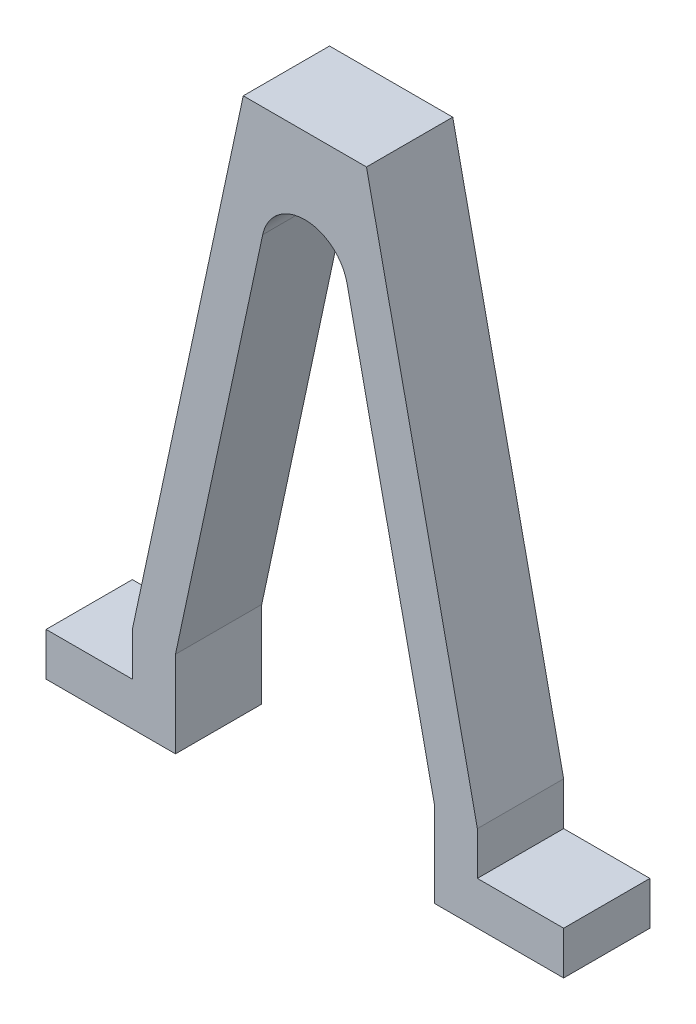
ISO-10303-21;
HEADER;
FILE_DESCRIPTION(('STEP AP214'),'2;1');
FILE_NAME('part.step','',(''),(''),'','','');
FILE_SCHEMA(('AUTOMOTIVE_DESIGN { 1 0 10303 214 1 1 1 1 }'));
ENDSEC;
DATA;
#1=APPLICATION_CONTEXT('core data for automotive mechanical design processes');
#2=APPLICATION_PROTOCOL_DEFINITION('international standard','automotive_design',2000,#1);
#3=PRODUCT_CONTEXT('',#1,'mechanical');
#4=PRODUCT('Part','Part','',(#3));
#5=PRODUCT_RELATED_PRODUCT_CATEGORY('part','',(#4));
#6=PRODUCT_DEFINITION_FORMATION('','',#4);
#7=PRODUCT_DEFINITION_CONTEXT('part definition',#1,'design');
#8=PRODUCT_DEFINITION('design','',#6,#7);
#9=PRODUCT_DEFINITION_SHAPE('','',#8);
#10=(LENGTH_UNIT() NAMED_UNIT(*) SI_UNIT(.MILLI.,.METRE.));
#11=(NAMED_UNIT(*) PLANE_ANGLE_UNIT() SI_UNIT($,.RADIAN.));
#12=(NAMED_UNIT(*) SI_UNIT($,.STERADIAN.) SOLID_ANGLE_UNIT());
#13=UNCERTAINTY_MEASURE_WITH_UNIT(LENGTH_MEASURE(1.E-05),#10,'distance_accuracy_value','');
#14=(GEOMETRIC_REPRESENTATION_CONTEXT(3) GLOBAL_UNCERTAINTY_ASSIGNED_CONTEXT((#13)) GLOBAL_UNIT_ASSIGNED_CONTEXT((#10,
#11,#12)) REPRESENTATION_CONTEXT('',''));
#15=CARTESIAN_POINT('',(0.,0.,0.));
#16=DIRECTION('',(0.,0.,1.));
#17=DIRECTION('',(1.,0.,0.));
#18=AXIS2_PLACEMENT_3D('',#15,#16,#17);
#19=CARTESIAN_POINT('',(0.,5.,10.));
#20=DIRECTION('',(1.,0.,0.));
#21=DIRECTION('',(0.,0.,-1.));
#22=AXIS2_PLACEMENT_3D('',#19,#20,#21);
#23=PLANE('',#22);
#24=DIRECTION('',(0.,-1.,0.));
#25=VECTOR('',#24,1.);
#26=CARTESIAN_POINT('',(0.,5.,0.));
#27=LINE('',#26,#25);
#28=CARTESIAN_POINT('',(0.,5.,0.));
#29=VERTEX_POINT('',#28);
#30=CARTESIAN_POINT('',(0.,0.,0.));
#31=VERTEX_POINT('',#30);
#32=EDGE_CURVE('E188',#29,#31,#27,.T.);
#33=ORIENTED_EDGE('',*,*,#32,.T.);
#34=DIRECTION('',(0.,0.,-1.));
#35=VECTOR('',#34,1.);
#36=CARTESIAN_POINT('',(0.,0.,10.));
#37=LINE('',#36,#35);
#38=CARTESIAN_POINT('',(0.,0.,10.));
#39=VERTEX_POINT('',#38);
#40=EDGE_CURVE('E274',#39,#31,#37,.T.);
#41=ORIENTED_EDGE('',*,*,#40,.F.);
#42=DIRECTION('',(0.,-1.,0.));
#43=VECTOR('',#42,1.);
#44=CARTESIAN_POINT('',(0.,5.,10.));
#45=LINE('',#44,#43);
#46=CARTESIAN_POINT('',(0.,5.,10.));
#47=VERTEX_POINT('',#46);
#48=EDGE_CURVE('E232',#47,#39,#45,.T.);
#49=ORIENTED_EDGE('',*,*,#48,.F.);
#50=DIRECTION('',(0.,0.,-1.));
#51=VECTOR('',#50,1.);
#52=CARTESIAN_POINT('',(0.,5.,10.));
#53=LINE('',#52,#51);
#54=EDGE_CURVE('E187',#47,#29,#53,.T.);
#55=ORIENTED_EDGE('',*,*,#54,.T.);
#56=EDGE_LOOP('',(#33,#41,#49,#55));
#57=FACE_BOUND('',#56,.T.);
#58=ADVANCED_FACE('F39',(#57),#23,.F.);
#59=CARTESIAN_POINT('',(0.,0.,10.));
#60=DIRECTION('',(0.,1.,0.));
#61=DIRECTION('',(0.,0.,1.));
#62=AXIS2_PLACEMENT_3D('',#59,#60,#61);
#63=PLANE('',#62);
#64=DIRECTION('',(1.,0.,0.));
#65=VECTOR('',#64,1.);
#66=CARTESIAN_POINT('',(0.,0.,0.));
#67=LINE('',#66,#65);
#68=CARTESIAN_POINT('',(15.,0.,0.));
#69=VERTEX_POINT('',#68);
#70=EDGE_CURVE('E192',#31,#69,#67,.T.);
#71=ORIENTED_EDGE('',*,*,#70,.T.);
#72=DIRECTION('',(0.,0.,-1.));
#73=VECTOR('',#72,1.);
#74=CARTESIAN_POINT('',(15.,0.,10.));
#75=LINE('',#74,#73);
#76=CARTESIAN_POINT('',(15.,0.,10.));
#77=VERTEX_POINT('',#76);
#78=EDGE_CURVE('E270',#77,#69,#75,.T.);
#79=ORIENTED_EDGE('',*,*,#78,.F.);
#80=DIRECTION('',(1.,0.,0.));
#81=VECTOR('',#80,1.);
#82=CARTESIAN_POINT('',(0.,0.,10.));
#83=LINE('',#82,#81);
#84=EDGE_CURVE('E318',#39,#77,#83,.T.);
#85=ORIENTED_EDGE('',*,*,#84,.F.);
#86=ORIENTED_EDGE('',*,*,#40,.T.);
#87=EDGE_LOOP('',(#71,#79,#85,#86));
#88=FACE_BOUND('',#87,.T.);
#89=ADVANCED_FACE('F317',(#88),#63,.F.);
#90=CARTESIAN_POINT('',(15.,0.,10.));
#91=DIRECTION('',(-1.,0.,0.));
#92=DIRECTION('',(0.,0.,1.));
#93=AXIS2_PLACEMENT_3D('',#90,#91,#92);
#94=PLANE('',#93);
#95=DIRECTION('',(0.,1.,0.));
#96=VECTOR('',#95,1.);
#97=CARTESIAN_POINT('',(15.,0.,0.));
#98=LINE('',#97,#96);
#99=CARTESIAN_POINT('',(15.,10.,0.));
#100=VERTEX_POINT('',#99);
#101=EDGE_CURVE('E195',#69,#100,#98,.T.);
#102=ORIENTED_EDGE('',*,*,#101,.T.);
#103=DIRECTION('',(0.,0.,-1.));
#104=VECTOR('',#103,1.);
#105=CARTESIAN_POINT('',(15.,10.,10.));
#106=LINE('',#105,#104);
#107=CARTESIAN_POINT('',(15.,10.,10.));
#108=VERTEX_POINT('',#107);
#109=EDGE_CURVE('E266',#108,#100,#106,.T.);
#110=ORIENTED_EDGE('',*,*,#109,.F.);
#111=DIRECTION('',(0.,1.,0.));
#112=VECTOR('',#111,1.);
#113=CARTESIAN_POINT('',(15.,0.,10.));
#114=LINE('',#113,#112);
#115=EDGE_CURVE('E311',#77,#108,#114,.T.);
#116=ORIENTED_EDGE('',*,*,#115,.F.);
#117=ORIENTED_EDGE('',*,*,#78,.T.);
#118=EDGE_LOOP('',(#102,#110,#116,#117));
#119=FACE_BOUND('',#118,.T.);
#120=ADVANCED_FACE('F310',(#119),#94,.F.);
#121=CARTESIAN_POINT('',(15.,10.,10.));
#122=DIRECTION('',(-0.97780241407741,0.209529088730873,0.));
#123=DIRECTION('',(-0.209529088730873,-0.97780241407741,0.));
#124=AXIS2_PLACEMENT_3D('',#121,#122,#123);
#125=PLANE('',#124);
#126=DIRECTION('',(0.209529088730873,0.97780241407741,0.));
#127=VECTOR('',#126,1.);
#128=CARTESIAN_POINT('',(15.,10.,0.));
#129=LINE('',#128,#127);
#130=CARTESIAN_POINT('',(25.1109879296129,57.1846103381938,0.));
#131=VERTEX_POINT('',#130);
#132=EDGE_CURVE('E198',#100,#131,#129,.T.);
#133=ORIENTED_EDGE('',*,*,#132,.T.);
#134=DIRECTION('',(0.,0.,-1.));
#135=VECTOR('',#134,1.);
#136=CARTESIAN_POINT('',(25.1109879296129,57.1846103381938,10.));
#137=LINE('',#136,#135);
#138=CARTESIAN_POINT('',(25.1109879296129,57.1846103381938,10.));
#139=VERTEX_POINT('',#138);
#140=EDGE_CURVE('E62',#131,#139,#137,.F.);
#141=ORIENTED_EDGE('',*,*,#140,.T.);
#142=DIRECTION('',(0.209529088730873,0.97780241407741,0.));
#143=VECTOR('',#142,1.);
#144=CARTESIAN_POINT('',(15.,10.,10.));
#145=LINE('',#144,#143);
#146=EDGE_CURVE('E291',#108,#139,#145,.T.);
#147=ORIENTED_EDGE('',*,*,#146,.F.);
#148=ORIENTED_EDGE('',*,*,#109,.T.);
#149=EDGE_LOOP('',(#133,#141,#147,#148));
#150=FACE_BOUND('',#149,.T.);
#151=ADVANCED_FACE('F306',(#150),#125,.F.);
#152=CARTESIAN_POINT('',(30.,80.,10.));
#153=DIRECTION('',(0.97780241407741,0.209529088730873,0.));
#154=DIRECTION('',(-0.209529088730873,0.97780241407741,0.));
#155=AXIS2_PLACEMENT_3D('',#152,#153,#154);
#156=PLANE('',#155);
#157=DIRECTION('',(0.209529088730873,-0.97780241407741,0.));
#158=VECTOR('',#157,1.);
#159=CARTESIAN_POINT('',(30.,80.,10.));
#160=LINE('',#159,#158);
#161=CARTESIAN_POINT('',(34.889012070387,57.1846103381938,10.));
#162=VERTEX_POINT('',#161);
#163=CARTESIAN_POINT('',(45.,10.,10.));
#164=VERTEX_POINT('',#163);
#165=EDGE_CURVE('E289',#162,#164,#160,.T.);
#166=ORIENTED_EDGE('',*,*,#165,.F.);
#167=DIRECTION('',(0.,0.,-1.));
#168=VECTOR('',#167,1.);
#169=CARTESIAN_POINT('',(34.889012070387,57.1846103381938,0.));
#170=LINE('',#169,#168);
#171=CARTESIAN_POINT('',(34.889012070387,57.1846103381938,0.));
#172=VERTEX_POINT('',#171);
#173=EDGE_CURVE('E278',#162,#172,#170,.T.);
#174=ORIENTED_EDGE('',*,*,#173,.T.);
#175=DIRECTION('',(0.209529088730873,-0.97780241407741,0.));
#176=VECTOR('',#175,1.);
#177=CARTESIAN_POINT('',(30.,80.,0.));
#178=LINE('',#177,#176);
#179=CARTESIAN_POINT('',(45.,10.,0.));
#180=VERTEX_POINT('',#179);
#181=EDGE_CURVE('E201',#172,#180,#178,.T.);
#182=ORIENTED_EDGE('',*,*,#181,.T.);
#183=DIRECTION('',(0.,0.,-1.));
#184=VECTOR('',#183,1.);
#185=CARTESIAN_POINT('',(45.,10.,10.));
#186=LINE('',#185,#184);
#187=EDGE_CURVE('E262',#164,#180,#186,.T.);
#188=ORIENTED_EDGE('',*,*,#187,.F.);
#189=EDGE_LOOP('',(#166,#174,#182,#188));
#190=FACE_BOUND('',#189,.T.);
#191=ADVANCED_FACE('F295',(#190),#156,.F.);
#192=CARTESIAN_POINT('',(45.,10.,10.));
#193=DIRECTION('',(1.,0.,0.));
#194=DIRECTION('',(0.,0.,-1.));
#195=AXIS2_PLACEMENT_3D('',#192,#193,#194);
#196=PLANE('',#195);
#197=DIRECTION('',(0.,-1.,0.));
#198=VECTOR('',#197,1.);
#199=CARTESIAN_POINT('',(45.,10.,0.));
#200=LINE('',#199,#198);
#201=CARTESIAN_POINT('',(45.,0.,0.));
#202=VERTEX_POINT('',#201);
#203=EDGE_CURVE('E204',#180,#202,#200,.T.);
#204=ORIENTED_EDGE('',*,*,#203,.T.);
#205=DIRECTION('',(0.,0.,-1.));
#206=VECTOR('',#205,1.);
#207=CARTESIAN_POINT('',(45.,0.,10.));
#208=LINE('',#207,#206);
#209=CARTESIAN_POINT('',(45.,0.,10.));
#210=VERTEX_POINT('',#209);
#211=EDGE_CURVE('E258',#210,#202,#208,.T.);
#212=ORIENTED_EDGE('',*,*,#211,.F.);
#213=DIRECTION('',(0.,-1.,0.));
#214=VECTOR('',#213,1.);
#215=CARTESIAN_POINT('',(45.,10.,10.));
#216=LINE('',#215,#214);
#217=EDGE_CURVE('E299',#164,#210,#216,.T.);
#218=ORIENTED_EDGE('',*,*,#217,.F.);
#219=ORIENTED_EDGE('',*,*,#187,.T.);
#220=EDGE_LOOP('',(#204,#212,#218,#219));
#221=FACE_BOUND('',#220,.T.);
#222=ADVANCED_FACE('F377',(#221),#196,.F.);
#223=CARTESIAN_POINT('',(45.,0.,10.));
#224=DIRECTION('',(0.,1.,0.));
#225=DIRECTION('',(0.,0.,1.));
#226=AXIS2_PLACEMENT_3D('',#223,#224,#225);
#227=PLANE('',#226);
#228=DIRECTION('',(1.,0.,0.));
#229=VECTOR('',#228,1.);
#230=CARTESIAN_POINT('',(45.,0.,0.));
#231=LINE('',#230,#229);
#232=CARTESIAN_POINT('',(60.,0.,0.));
#233=VERTEX_POINT('',#232);
#234=EDGE_CURVE('E207',#202,#233,#231,.T.);
#235=ORIENTED_EDGE('',*,*,#234,.T.);
#236=DIRECTION('',(0.,0.,-1.));
#237=VECTOR('',#236,1.);
#238=CARTESIAN_POINT('',(60.,0.,10.));
#239=LINE('',#238,#237);
#240=CARTESIAN_POINT('',(60.,0.,10.));
#241=VERTEX_POINT('',#240);
#242=EDGE_CURVE('E254',#241,#233,#239,.T.);
#243=ORIENTED_EDGE('',*,*,#242,.F.);
#244=DIRECTION('',(1.,0.,0.));
#245=VECTOR('',#244,1.);
#246=CARTESIAN_POINT('',(45.,0.,10.));
#247=LINE('',#246,#245);
#248=EDGE_CURVE('E342',#210,#241,#247,.T.);
#249=ORIENTED_EDGE('',*,*,#248,.F.);
#250=ORIENTED_EDGE('',*,*,#211,.T.);
#251=EDGE_LOOP('',(#235,#243,#249,#250));
#252=FACE_BOUND('',#251,.T.);
#253=ADVANCED_FACE('F374',(#252),#227,.F.);
#254=CARTESIAN_POINT('',(60.,0.,10.));
#255=DIRECTION('',(-1.,0.,0.));
#256=DIRECTION('',(0.,0.,1.));
#257=AXIS2_PLACEMENT_3D('',#254,#255,#256);
#258=PLANE('',#257);
#259=DIRECTION('',(0.,1.,0.));
#260=VECTOR('',#259,1.);
#261=CARTESIAN_POINT('',(60.,0.,0.));
#262=LINE('',#261,#260);
#263=CARTESIAN_POINT('',(60.,5.00000000000001,0.));
#264=VERTEX_POINT('',#263);
#265=EDGE_CURVE('E210',#233,#264,#262,.T.);
#266=ORIENTED_EDGE('',*,*,#265,.T.);
#267=DIRECTION('',(0.,0.,-1.));
#268=VECTOR('',#267,1.);
#269=CARTESIAN_POINT('',(60.,5.00000000000001,10.));
#270=LINE('',#269,#268);
#271=CARTESIAN_POINT('',(60.,5.00000000000001,10.));
#272=VERTEX_POINT('',#271);
#273=EDGE_CURVE('E250',#272,#264,#270,.T.);
#274=ORIENTED_EDGE('',*,*,#273,.F.);
#275=DIRECTION('',(0.,1.,0.));
#276=VECTOR('',#275,1.);
#277=CARTESIAN_POINT('',(60.,0.,10.));
#278=LINE('',#277,#276);
#279=EDGE_CURVE('E345',#241,#272,#278,.T.);
#280=ORIENTED_EDGE('',*,*,#279,.F.);
#281=ORIENTED_EDGE('',*,*,#242,.T.);
#282=EDGE_LOOP('',(#266,#274,#280,#281));
#283=FACE_BOUND('',#282,.T.);
#284=ADVANCED_FACE('F370',(#283),#258,.F.);
#285=CARTESIAN_POINT('',(60.,5.00000000000001,10.));
#286=DIRECTION('',(0.,-1.,0.));
#287=DIRECTION('',(0.,0.,-1.));
#288=AXIS2_PLACEMENT_3D('',#285,#286,#287);
#289=PLANE('',#288);
#290=DIRECTION('',(-1.,0.,0.));
#291=VECTOR('',#290,1.);
#292=CARTESIAN_POINT('',(60.,5.00000000000001,0.));
#293=LINE('',#292,#291);
#294=CARTESIAN_POINT('',(50.,5.00000000000001,0.));
#295=VERTEX_POINT('',#294);
#296=EDGE_CURVE('E213',#264,#295,#293,.T.);
#297=ORIENTED_EDGE('',*,*,#296,.T.);
#298=DIRECTION('',(0.,0.,-1.));
#299=VECTOR('',#298,1.);
#300=CARTESIAN_POINT('',(50.,5.00000000000001,10.));
#301=LINE('',#300,#299);
#302=CARTESIAN_POINT('',(50.,5.00000000000001,10.));
#303=VERTEX_POINT('',#302);
#304=EDGE_CURVE('E246',#303,#295,#301,.T.);
#305=ORIENTED_EDGE('',*,*,#304,.F.);
#306=DIRECTION('',(-1.,0.,0.));
#307=VECTOR('',#306,1.);
#308=CARTESIAN_POINT('',(60.,5.00000000000001,10.));
#309=LINE('',#308,#307);
#310=EDGE_CURVE('E348',#272,#303,#309,.T.);
#311=ORIENTED_EDGE('',*,*,#310,.F.);
#312=ORIENTED_EDGE('',*,*,#273,.T.);
#313=EDGE_LOOP('',(#297,#305,#311,#312));
#314=FACE_BOUND('',#313,.T.);
#315=ADVANCED_FACE('F366',(#314),#289,.F.);
#316=CARTESIAN_POINT('',(50.,5.00000000000001,10.));
#317=DIRECTION('',(-1.,0.,0.));
#318=DIRECTION('',(0.,0.,1.));
#319=AXIS2_PLACEMENT_3D('',#316,#317,#318);
#320=PLANE('',#319);
#321=DIRECTION('',(0.,1.,0.));
#322=VECTOR('',#321,1.);
#323=CARTESIAN_POINT('',(50.,5.00000000000001,0.));
#324=LINE('',#323,#322);
#325=CARTESIAN_POINT('',(50.,10.,0.));
#326=VERTEX_POINT('',#325);
#327=EDGE_CURVE('E216',#295,#326,#324,.T.);
#328=ORIENTED_EDGE('',*,*,#327,.T.);
#329=DIRECTION('',(0.,0.,-1.));
#330=VECTOR('',#329,1.);
#331=CARTESIAN_POINT('',(50.,10.,10.));
#332=LINE('',#331,#330);
#333=CARTESIAN_POINT('',(50.,10.,10.));
#334=VERTEX_POINT('',#333);
#335=EDGE_CURVE('E242',#334,#326,#332,.T.);
#336=ORIENTED_EDGE('',*,*,#335,.F.);
#337=DIRECTION('',(0.,1.,0.));
#338=VECTOR('',#337,1.);
#339=CARTESIAN_POINT('',(50.,5.00000000000001,10.));
#340=LINE('',#339,#338);
#341=EDGE_CURVE('E181',#303,#334,#340,.T.);
#342=ORIENTED_EDGE('',*,*,#341,.F.);
#343=ORIENTED_EDGE('',*,*,#304,.T.);
#344=EDGE_LOOP('',(#328,#336,#342,#343));
#345=FACE_BOUND('',#344,.T.);
#346=ADVANCED_FACE('F356',(#345),#320,.F.);
#347=CARTESIAN_POINT('',(50.,10.,10.));
#348=DIRECTION('',(-0.97780241407741,-0.209529088730873,0.));
#349=DIRECTION('',(0.209529088730873,-0.97780241407741,0.));
#350=AXIS2_PLACEMENT_3D('',#347,#348,#349);
#351=PLANE('',#350);
#352=DIRECTION('',(-0.209529088730873,0.97780241407741,0.));
#353=VECTOR('',#352,1.);
#354=CARTESIAN_POINT('',(50.,10.,0.));
#355=LINE('',#354,#353);
#356=CARTESIAN_POINT('',(37.1428571428571,70.,0.));
#357=VERTEX_POINT('',#356);
#358=EDGE_CURVE('E219',#326,#357,#355,.T.);
#359=ORIENTED_EDGE('',*,*,#358,.T.);
#360=DIRECTION('',(0.,0.,1.));
#361=VECTOR('',#360,1.);
#362=CARTESIAN_POINT('',(37.1428571428571,70.,10.));
#363=LINE('',#362,#361);
#364=CARTESIAN_POINT('',(37.1428571428571,70.,10.));
#365=VERTEX_POINT('',#364);
#366=EDGE_CURVE('E55',#357,#365,#363,.T.);
#367=ORIENTED_EDGE('',*,*,#366,.T.);
#368=DIRECTION('',(-0.209529088730873,0.97780241407741,0.));
#369=VECTOR('',#368,1.);
#370=CARTESIAN_POINT('',(50.,10.,10.));
#371=LINE('',#370,#369);
#372=EDGE_CURVE('E167',#334,#365,#371,.T.);
#373=ORIENTED_EDGE('',*,*,#372,.F.);
#374=ORIENTED_EDGE('',*,*,#335,.T.);
#375=EDGE_LOOP('',(#359,#367,#373,#374));
#376=FACE_BOUND('',#375,.T.);
#377=ADVANCED_FACE('F360',(#376),#351,.F.);
#378=CARTESIAN_POINT('',(30.,103.333333333333,10.));
#379=DIRECTION('',(0.97780241407741,-0.209529088730873,0.));
#380=DIRECTION('',(0.209529088730873,0.97780241407741,0.));
#381=AXIS2_PLACEMENT_3D('',#378,#379,#380);
#382=PLANE('',#381);
#383=DIRECTION('',(-0.209529088730873,-0.97780241407741,0.));
#384=VECTOR('',#383,1.);
#385=CARTESIAN_POINT('',(30.,103.333333333333,10.));
#386=LINE('',#385,#384);
#387=CARTESIAN_POINT('',(22.8571428571429,70.,10.));
#388=VERTEX_POINT('',#387);
#389=CARTESIAN_POINT('',(10.,10.,10.));
#390=VERTEX_POINT('',#389);
#391=EDGE_CURVE('E164',#388,#390,#386,.T.);
#392=ORIENTED_EDGE('',*,*,#391,.F.);
#393=DIRECTION('',(0.,0.,-1.));
#394=VECTOR('',#393,1.);
#395=CARTESIAN_POINT('',(22.8571428571429,70.,10.));
#396=LINE('',#395,#394);
#397=CARTESIAN_POINT('',(22.8571428571429,70.,0.));
#398=VERTEX_POINT('',#397);
#399=EDGE_CURVE('E152',#388,#398,#396,.T.);
#400=ORIENTED_EDGE('',*,*,#399,.T.);
#401=DIRECTION('',(-0.209529088730873,-0.97780241407741,0.));
#402=VECTOR('',#401,1.);
#403=CARTESIAN_POINT('',(30.,103.333333333333,0.));
#404=LINE('',#403,#402);
#405=CARTESIAN_POINT('',(10.,10.,0.));
#406=VERTEX_POINT('',#405);
#407=EDGE_CURVE('E223',#398,#406,#404,.T.);
#408=ORIENTED_EDGE('',*,*,#407,.T.);
#409=DIRECTION('',(0.,0.,-1.));
#410=VECTOR('',#409,1.);
#411=CARTESIAN_POINT('',(10.,10.,10.));
#412=LINE('',#411,#410);
#413=EDGE_CURVE('E172',#390,#406,#412,.T.);
#414=ORIENTED_EDGE('',*,*,#413,.F.);
#415=EDGE_LOOP('',(#392,#400,#408,#414));
#416=FACE_BOUND('',#415,.T.);
#417=ADVANCED_FACE('F170',(#416),#382,.F.);
#418=CARTESIAN_POINT('',(10.,10.,10.));
#419=DIRECTION('',(1.,0.,0.));
#420=DIRECTION('',(0.,0.,-1.));
#421=AXIS2_PLACEMENT_3D('',#418,#419,#420);
#422=PLANE('',#421);
#423=DIRECTION('',(0.,-1.,0.));
#424=VECTOR('',#423,1.);
#425=CARTESIAN_POINT('',(10.,10.,0.));
#426=LINE('',#425,#424);
#427=CARTESIAN_POINT('',(10.,5.,0.));
#428=VERTEX_POINT('',#427);
#429=EDGE_CURVE('E226',#406,#428,#426,.T.);
#430=ORIENTED_EDGE('',*,*,#429,.T.);
#431=DIRECTION('',(0.,0.,-1.));
#432=VECTOR('',#431,1.);
#433=CARTESIAN_POINT('',(10.,5.,10.));
#434=LINE('',#433,#432);
#435=CARTESIAN_POINT('',(10.,5.,10.));
#436=VERTEX_POINT('',#435);
#437=EDGE_CURVE('E236',#436,#428,#434,.T.);
#438=ORIENTED_EDGE('',*,*,#437,.F.);
#439=DIRECTION('',(0.,-1.,0.));
#440=VECTOR('',#439,1.);
#441=CARTESIAN_POINT('',(10.,10.,10.));
#442=LINE('',#441,#440);
#443=EDGE_CURVE('E175',#390,#436,#442,.T.);
#444=ORIENTED_EDGE('',*,*,#443,.F.);
#445=ORIENTED_EDGE('',*,*,#413,.T.);
#446=EDGE_LOOP('',(#430,#438,#444,#445));
#447=FACE_BOUND('',#446,.T.);
#448=ADVANCED_FACE('F329',(#447),#422,.F.);
#449=CARTESIAN_POINT('',(10.,5.,10.));
#450=DIRECTION('',(0.,-1.,0.));
#451=DIRECTION('',(1.,0.,0.));
#452=AXIS2_PLACEMENT_3D('',#449,#450,#451);
#453=PLANE('',#452);
#454=DIRECTION('',(-1.,0.,0.));
#455=VECTOR('',#454,1.);
#456=CARTESIAN_POINT('',(10.,5.,0.));
#457=LINE('',#456,#455);
#458=EDGE_CURVE('E229',#428,#29,#457,.T.);
#459=ORIENTED_EDGE('',*,*,#458,.T.);
#460=ORIENTED_EDGE('',*,*,#54,.F.);
#461=DIRECTION('',(-1.,0.,0.));
#462=VECTOR('',#461,1.);
#463=CARTESIAN_POINT('',(10.,5.,10.));
#464=LINE('',#463,#462);
#465=EDGE_CURVE('E179',#436,#47,#464,.T.);
#466=ORIENTED_EDGE('',*,*,#465,.F.);
#467=ORIENTED_EDGE('',*,*,#437,.T.);
#468=EDGE_LOOP('',(#459,#460,#466,#467));
#469=FACE_BOUND('',#468,.T.);
#470=ADVANCED_FACE('F325',(#469),#453,.F.);
#471=CARTESIAN_POINT('',(0.,0.,10.));
#472=DIRECTION('',(0.,0.,1.));
#473=DIRECTION('',(1.,0.,0.));
#474=AXIS2_PLACEMENT_3D('',#471,#472,#473);
#475=PLANE('',#474);
#476=DIRECTION('',(1.,0.,0.));
#477=VECTOR('',#476,1.);
#478=CARTESIAN_POINT('',(17.1801084909166,70.,10.));
#479=LINE('',#478,#477);
#480=EDGE_CURVE('E155',#388,#365,#479,.T.);
#481=ORIENTED_EDGE('',*,*,#480,.F.);
#482=ORIENTED_EDGE('',*,*,#391,.T.);
#483=ORIENTED_EDGE('',*,*,#443,.T.);
#484=ORIENTED_EDGE('',*,*,#465,.T.);
#485=ORIENTED_EDGE('',*,*,#48,.T.);
#486=ORIENTED_EDGE('',*,*,#84,.T.);
#487=ORIENTED_EDGE('',*,*,#115,.T.);
#488=ORIENTED_EDGE('',*,*,#146,.T.);
#489=CARTESIAN_POINT('',(30.,56.1369648945394,10.));
#490=DIRECTION('',(0.,0.,1.));
#491=DIRECTION('',(1.,0.,0.));
#492=AXIS2_PLACEMENT_3D('',#489,#490,#491);
#493=CIRCLE('',#492,5.);
#494=EDGE_CURVE('E48',#139,#162,#493,.F.);
#495=ORIENTED_EDGE('',*,*,#494,.T.);
#496=ORIENTED_EDGE('',*,*,#165,.T.);
#497=ORIENTED_EDGE('',*,*,#217,.T.);
#498=ORIENTED_EDGE('',*,*,#248,.T.);
#499=ORIENTED_EDGE('',*,*,#279,.T.);
#500=ORIENTED_EDGE('',*,*,#310,.T.);
#501=ORIENTED_EDGE('',*,*,#341,.T.);
#502=ORIENTED_EDGE('',*,*,#372,.T.);
#503=EDGE_LOOP('',(#481,#482,#483,#484,#485,#486,#487,#488,#495,#496,#497,#498,#499,#500,#501,#502));
#504=FACE_BOUND('',#503,.T.);
#505=ADVANCED_FACE('F163',(#504),#475,.T.);
#506=CARTESIAN_POINT('',(0.,0.,0.));
#507=DIRECTION('',(0.,0.,1.));
#508=DIRECTION('',(1.,0.,0.));
#509=AXIS2_PLACEMENT_3D('',#506,#507,#508);
#510=PLANE('',#509);
#511=ORIENTED_EDGE('',*,*,#407,.F.);
#512=DIRECTION('',(1.,0.,0.));
#513=VECTOR('',#512,1.);
#514=CARTESIAN_POINT('',(0.,70.,0.));
#515=LINE('',#514,#513);
#516=EDGE_CURVE('E11',#398,#357,#515,.T.);
#517=ORIENTED_EDGE('',*,*,#516,.T.);
#518=ORIENTED_EDGE('',*,*,#358,.F.);
#519=ORIENTED_EDGE('',*,*,#327,.F.);
#520=ORIENTED_EDGE('',*,*,#296,.F.);
#521=ORIENTED_EDGE('',*,*,#265,.F.);
#522=ORIENTED_EDGE('',*,*,#234,.F.);
#523=ORIENTED_EDGE('',*,*,#203,.F.);
#524=ORIENTED_EDGE('',*,*,#181,.F.);
#525=CARTESIAN_POINT('',(30.,56.1369648945394,0.));
#526=DIRECTION('',(0.,0.,1.));
#527=DIRECTION('',(1.,0.,0.));
#528=AXIS2_PLACEMENT_3D('',#525,#526,#527);
#529=CIRCLE('',#528,5.);
#530=EDGE_CURVE('E284',#172,#131,#529,.T.);
#531=ORIENTED_EDGE('',*,*,#530,.T.);
#532=ORIENTED_EDGE('',*,*,#132,.F.);
#533=ORIENTED_EDGE('',*,*,#101,.F.);
#534=ORIENTED_EDGE('',*,*,#70,.F.);
#535=ORIENTED_EDGE('',*,*,#32,.F.);
#536=ORIENTED_EDGE('',*,*,#458,.F.);
#537=ORIENTED_EDGE('',*,*,#429,.F.);
#538=EDGE_LOOP('',(#511,#517,#518,#519,#520,#521,#522,#523,#524,#531,#532,#533,#534,#535,#536,#537));
#539=FACE_BOUND('',#538,.T.);
#540=ADVANCED_FACE('F303',(#539),#510,.F.);
#541=CARTESIAN_POINT('',(30.,56.1369648945394,10.));
#542=DIRECTION('',(0.,0.,1.));
#543=DIRECTION('',(1.,0.,0.));
#544=AXIS2_PLACEMENT_3D('',#541,#542,#543);
#545=CYLINDRICAL_SURFACE('',#544,5.);
#546=ORIENTED_EDGE('',*,*,#494,.F.);
#547=ORIENTED_EDGE('',*,*,#140,.F.);
#548=ORIENTED_EDGE('',*,*,#530,.F.);
#549=ORIENTED_EDGE('',*,*,#173,.F.);
#550=EDGE_LOOP('',(#546,#547,#548,#549));
#551=FACE_BOUND('',#550,.T.);
#552=ADVANCED_FACE('F41',(#551),#545,.F.);
#553=CARTESIAN_POINT('',(17.1801084909166,70.,0.));
#554=DIRECTION('',(0.,-1.,0.));
#555=DIRECTION('',(0.,0.,-1.));
#556=AXIS2_PLACEMENT_3D('',#553,#554,#555);
#557=PLANE('',#556);
#558=ORIENTED_EDGE('',*,*,#516,.F.);
#559=ORIENTED_EDGE('',*,*,#399,.F.);
#560=ORIENTED_EDGE('',*,*,#480,.T.);
#561=ORIENTED_EDGE('',*,*,#366,.F.);
#562=EDGE_LOOP('',(#558,#559,#560,#561));
#563=FACE_BOUND('',#562,.T.);
#564=ADVANCED_FACE('F154',(#563),#557,.F.);
#565=CLOSED_SHELL('',(#58,#89,#120,#151,#191,#222,#253,#284,#315,#346,#377,#417,#448,#470,#505,
#540,#552,#564));
#566=MANIFOLD_SOLID_BREP('B2',#565);
#567=ADVANCED_BREP_SHAPE_REPRESENTATION('',(#18,#566),#14);
#568=SHAPE_DEFINITION_REPRESENTATION(#9,#567);
ENDSEC;
END-ISO-10303-21;
